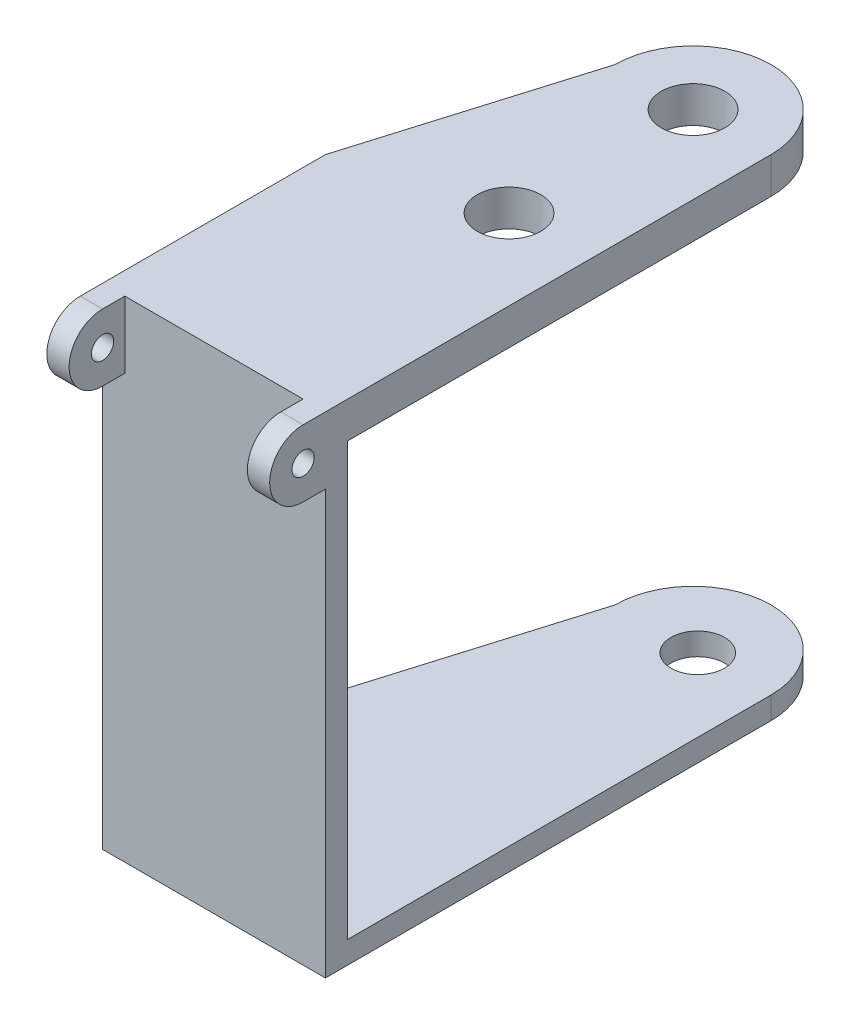
ISO-10303-21;
HEADER;
FILE_DESCRIPTION(('STEP AP214'),'2;1');
FILE_NAME('part.step','',(''),(''),'','','');
FILE_SCHEMA(('AUTOMOTIVE_DESIGN { 1 0 10303 214 1 1 1 1 }'));
ENDSEC;
DATA;
#1=APPLICATION_CONTEXT('core data for automotive mechanical design processes');
#2=APPLICATION_PROTOCOL_DEFINITION('international standard','automotive_design',2000,#1);
#3=PRODUCT_CONTEXT('',#1,'mechanical');
#4=PRODUCT('Part','Part','',(#3));
#5=PRODUCT_RELATED_PRODUCT_CATEGORY('part','',(#4));
#6=PRODUCT_DEFINITION_FORMATION('','',#4);
#7=PRODUCT_DEFINITION_CONTEXT('part definition',#1,'design');
#8=PRODUCT_DEFINITION('design','',#6,#7);
#9=PRODUCT_DEFINITION_SHAPE('','',#8);
#10=(LENGTH_UNIT() NAMED_UNIT(*) SI_UNIT(.MILLI.,.METRE.));
#11=(NAMED_UNIT(*) PLANE_ANGLE_UNIT() SI_UNIT($,.RADIAN.));
#12=(NAMED_UNIT(*) SI_UNIT($,.STERADIAN.) SOLID_ANGLE_UNIT());
#13=UNCERTAINTY_MEASURE_WITH_UNIT(LENGTH_MEASURE(1.E-05),#10,'distance_accuracy_value','');
#14=(GEOMETRIC_REPRESENTATION_CONTEXT(3) GLOBAL_UNCERTAINTY_ASSIGNED_CONTEXT((#13)) GLOBAL_UNIT_ASSIGNED_CONTEXT((#10,
#11,#12)) REPRESENTATION_CONTEXT('',''));
#15=CARTESIAN_POINT('',(0.,0.,0.));
#16=DIRECTION('',(0.,0.,1.));
#17=DIRECTION('',(1.,0.,0.));
#18=AXIS2_PLACEMENT_3D('',#15,#16,#17);
#19=CARTESIAN_POINT('',(-6.32944380535266,-18.6300290870616,8.81175741175494));
#20=DIRECTION('',(0.,0.,1.));
#21=DIRECTION('',(1.,0.,0.));
#22=AXIS2_PLACEMENT_3D('',#19,#20,#21);
#23=PLANE('',#22);
#24=DIRECTION('',(-1.,0.,0.));
#25=VECTOR('',#24,1.);
#26=CARTESIAN_POINT('',(-6.32944380535266,6.37269818566567,8.81175741175494));
#27=LINE('',#26,#25);
#28=CARTESIAN_POINT('',(5.94328346737462,6.37269818566567,8.81175741175494));
#29=VERTEX_POINT('',#28);
#30=CARTESIAN_POINT('',(-6.32944380535266,6.37269818566567,8.81175741175494));
#31=VERTEX_POINT('',#30);
#32=EDGE_CURVE('E187',#29,#31,#27,.T.);
#33=ORIENTED_EDGE('',*,*,#32,.F.);
#34=DIRECTION('',(0.,1.,0.));
#35=VECTOR('',#34,1.);
#36=CARTESIAN_POINT('',(5.94328346737462,-18.6300290870616,8.81175741175494));
#37=LINE('',#36,#35);
#38=CARTESIAN_POINT('',(5.94328346737462,-17.4027563597889,8.81175741175494));
#39=VERTEX_POINT('',#38);
#40=EDGE_CURVE('E173',#39,#29,#37,.T.);
#41=ORIENTED_EDGE('',*,*,#40,.F.);
#42=DIRECTION('',(1.,0.,0.));
#43=VECTOR('',#42,1.);
#44=CARTESIAN_POINT('',(-6.32944380535266,-17.4027563597889,8.81175741175494));
#45=LINE('',#44,#43);
#46=CARTESIAN_POINT('',(-6.32944380535266,-17.4027563597889,8.81175741175494));
#47=VERTEX_POINT('',#46);
#48=EDGE_CURVE('E335',#47,#39,#45,.T.);
#49=ORIENTED_EDGE('',*,*,#48,.F.);
#50=DIRECTION('',(0.,1.,0.));
#51=VECTOR('',#50,1.);
#52=CARTESIAN_POINT('',(-6.32944380535266,-18.6300290870616,8.81175741175494));
#53=LINE('',#52,#51);
#54=EDGE_CURVE('E356',#47,#31,#53,.T.);
#55=ORIENTED_EDGE('',*,*,#54,.T.);
#56=EDGE_LOOP('',(#33,#41,#49,#55));
#57=FACE_BOUND('',#56,.T.);
#58=ADVANCED_FACE('F43',(#57),#23,.F.);
#59=CARTESIAN_POINT('',(5.94328346737462,8.3699709129384,10.0390301390277));
#60=DIRECTION('',(0.,0.,-1.));
#61=DIRECTION('',(-1.,0.,0.));
#62=AXIS2_PLACEMENT_3D('',#59,#60,#61);
#63=PLANE('',#62);
#64=DIRECTION('',(0.,-1.,0.));
#65=VECTOR('',#64,1.);
#66=CARTESIAN_POINT('',(4.71601074010189,8.3699709129384,10.0390301390277));
#67=LINE('',#66,#65);
#68=CARTESIAN_POINT('',(4.71601074010189,8.3699709129384,10.0390301390277));
#69=VERTEX_POINT('',#68);
#70=CARTESIAN_POINT('',(4.71601074010189,4.68815273112021,10.0390301390277));
#71=VERTEX_POINT('',#70);
#72=EDGE_CURVE('E59',#69,#71,#67,.T.);
#73=ORIENTED_EDGE('',*,*,#72,.F.);
#74=DIRECTION('',(-1.,0.,0.));
#75=VECTOR('',#74,1.);
#76=CARTESIAN_POINT('',(5.94328346737462,8.3699709129384,10.0390301390277));
#77=LINE('',#76,#75);
#78=CARTESIAN_POINT('',(-5.10217107807993,8.3699709129384,10.0390301390277));
#79=VERTEX_POINT('',#78);
#80=EDGE_CURVE('E220',#69,#79,#77,.T.);
#81=ORIENTED_EDGE('',*,*,#80,.T.);
#82=DIRECTION('',(0.,-1.,0.));
#83=VECTOR('',#82,1.);
#84=CARTESIAN_POINT('',(-5.10217107807993,8.3699709129384,10.0390301390277));
#85=LINE('',#84,#83);
#86=CARTESIAN_POINT('',(-5.10217107807993,4.68815273112021,10.0390301390277));
#87=VERTEX_POINT('',#86);
#88=EDGE_CURVE('E247',#79,#87,#85,.T.);
#89=ORIENTED_EDGE('',*,*,#88,.T.);
#90=DIRECTION('',(-1.,0.,0.));
#91=VECTOR('',#90,1.);
#92=CARTESIAN_POINT('',(-5.10217107807993,4.68815273112021,10.0390301390277));
#93=LINE('',#92,#91);
#94=CARTESIAN_POINT('',(-6.32944380535266,4.68815273112021,10.0390301390277));
#95=VERTEX_POINT('',#94);
#96=EDGE_CURVE('E254',#87,#95,#93,.T.);
#97=ORIENTED_EDGE('',*,*,#96,.T.);
#98=DIRECTION('',(0.,-1.,0.));
#99=VECTOR('',#98,1.);
#100=CARTESIAN_POINT('',(-6.32944380535266,8.3699709129384,10.0390301390277));
#101=LINE('',#100,#99);
#102=CARTESIAN_POINT('',(-6.32944380535266,-18.6300290870616,10.0390301390277));
#103=VERTEX_POINT('',#102);
#104=EDGE_CURVE('E52',#95,#103,#101,.T.);
#105=ORIENTED_EDGE('',*,*,#104,.T.);
#106=DIRECTION('',(-1.,0.,0.));
#107=VECTOR('',#106,1.);
#108=CARTESIAN_POINT('',(-6.32944380535266,-18.6300290870616,10.0390301390277));
#109=LINE('',#108,#107);
#110=CARTESIAN_POINT('',(5.94328346737462,-18.6300290870616,10.0390301390277));
#111=VERTEX_POINT('',#110);
#112=EDGE_CURVE('E349',#111,#103,#109,.T.);
#113=ORIENTED_EDGE('',*,*,#112,.F.);
#114=DIRECTION('',(0.,-1.,0.));
#115=VECTOR('',#114,1.);
#116=CARTESIAN_POINT('',(5.94328346737462,8.3699709129384,10.0390301390277));
#117=LINE('',#116,#115);
#118=CARTESIAN_POINT('',(5.94328346737462,4.68815273112021,10.0390301390277));
#119=VERTEX_POINT('',#118);
#120=EDGE_CURVE('E367',#119,#111,#117,.T.);
#121=ORIENTED_EDGE('',*,*,#120,.F.);
#122=DIRECTION('',(1.,0.,0.));
#123=VECTOR('',#122,1.);
#124=CARTESIAN_POINT('',(4.71601074010189,4.68815273112021,10.0390301390277));
#125=LINE('',#124,#123);
#126=EDGE_CURVE('E290',#71,#119,#125,.T.);
#127=ORIENTED_EDGE('',*,*,#126,.F.);
#128=EDGE_LOOP('',(#73,#81,#89,#97,#105,#113,#121,#127));
#129=FACE_BOUND('',#128,.T.);
#130=ADVANCED_FACE('F380',(#129),#63,.F.);
#131=CARTESIAN_POINT('',(-6.32944380535266,8.3699709129384,10.0390301390277));
#132=DIRECTION('',(1.,0.,0.));
#133=DIRECTION('',(0.,0.,-1.));
#134=AXIS2_PLACEMENT_3D('',#131,#132,#133);
#135=PLANE('',#134);
#136=CARTESIAN_POINT('',(-6.32944380535266,6.52906182202931,11.2663028663004));
#137=DIRECTION('',(-1.,0.,0.));
#138=DIRECTION('',(0.,0.,1.));
#139=AXIS2_PLACEMENT_3D('',#136,#137,#138);
#140=CIRCLE('',#139,0.613636363636365);
#141=CARTESIAN_POINT('',(-6.32944380535266,6.52906182202931,11.8799392299368));
#142=VERTEX_POINT('',#141);
#143=EDGE_CURVE('E234',#142,#142,#140,.T.);
#144=ORIENTED_EDGE('',*,*,#143,.F.);
#145=EDGE_LOOP('',(#144));
#146=FACE_BOUND('',#145,.T.);
#147=CARTESIAN_POINT('',(-6.32944380535266,6.52906182202931,11.2663028663004));
#148=DIRECTION('',(-1.,0.,0.));
#149=DIRECTION('',(0.,0.,1.));
#150=AXIS2_PLACEMENT_3D('',#147,#148,#149);
#151=CIRCLE('',#150,1.84090909090909);
#152=CARTESIAN_POINT('',(-6.32944380535266,4.68815273112021,11.2663028663004));
#153=VERTEX_POINT('',#152);
#154=CARTESIAN_POINT('',(-6.32944380535266,8.3699709129384,11.2663028663004));
#155=VERTEX_POINT('',#154);
#156=EDGE_CURVE('E239',#153,#155,#151,.T.);
#157=ORIENTED_EDGE('',*,*,#156,.T.);
#158=DIRECTION('',(0.,0.,-1.));
#159=VECTOR('',#158,1.);
#160=CARTESIAN_POINT('',(-6.32944380535266,8.3699709129384,11.2663028663004));
#161=LINE('',#160,#159);
#162=CARTESIAN_POINT('',(-6.32944380535266,8.3699709129384,-2.2336971336996));
#163=VERTEX_POINT('',#162);
#164=EDGE_CURVE('E168',#155,#163,#161,.T.);
#165=ORIENTED_EDGE('',*,*,#164,.T.);
#166=DIRECTION('',(0.,1.,0.));
#167=VECTOR('',#166,1.);
#168=CARTESIAN_POINT('',(-6.32944380535266,4.6881527311202,-2.2336971336996));
#169=LINE('',#168,#167);
#170=CARTESIAN_POINT('',(-6.32944380535266,6.37269818566567,-2.2336971336996));
#171=VERTEX_POINT('',#170);
#172=EDGE_CURVE('E161',#171,#163,#169,.T.);
#173=ORIENTED_EDGE('',*,*,#172,.F.);
#174=DIRECTION('',(0.,0.,-1.));
#175=VECTOR('',#174,1.);
#176=CARTESIAN_POINT('',(-6.32944380535266,6.37269818566567,-2.2336971336996));
#177=LINE('',#176,#175);
#178=EDGE_CURVE('E166',#31,#171,#177,.T.);
#179=ORIENTED_EDGE('',*,*,#178,.F.);
#180=ORIENTED_EDGE('',*,*,#54,.F.);
#181=DIRECTION('',(0.,0.,1.));
#182=VECTOR('',#181,1.);
#183=CARTESIAN_POINT('',(-6.32944380535266,-17.4027563597889,-15.7336971336996));
#184=LINE('',#183,#182);
#185=CARTESIAN_POINT('',(-6.32944380535266,-17.4027563597889,-2.2336971336996));
#186=VERTEX_POINT('',#185);
#187=EDGE_CURVE('E339',#186,#47,#184,.T.);
#188=ORIENTED_EDGE('',*,*,#187,.F.);
#189=DIRECTION('',(0.,1.,0.));
#190=VECTOR('',#189,1.);
#191=CARTESIAN_POINT('',(-6.32944380535266,-41.9482109052434,-2.2336971336996));
#192=LINE('',#191,#190);
#193=CARTESIAN_POINT('',(-6.32944380535266,-18.6300290870616,-2.2336971336996));
#194=VERTEX_POINT('',#193);
#195=EDGE_CURVE('E326',#194,#186,#192,.T.);
#196=ORIENTED_EDGE('',*,*,#195,.F.);
#197=DIRECTION('',(0.,0.,-1.));
#198=VECTOR('',#197,1.);
#199=CARTESIAN_POINT('',(-6.32944380535266,-18.6300290870616,8.81175741175494));
#200=LINE('',#199,#198);
#201=EDGE_CURVE('E352',#103,#194,#200,.T.);
#202=ORIENTED_EDGE('',*,*,#201,.F.);
#203=ORIENTED_EDGE('',*,*,#104,.F.);
#204=DIRECTION('',(0.,0.,-1.));
#205=VECTOR('',#204,1.);
#206=CARTESIAN_POINT('',(-6.32944380535266,4.68815273112021,11.2663028663004));
#207=LINE('',#206,#205);
#208=EDGE_CURVE('E266',#153,#95,#207,.T.);
#209=ORIENTED_EDGE('',*,*,#208,.F.);
#210=EDGE_LOOP('',(#157,#165,#173,#179,#180,#188,#196,#202,#203,#209));
#211=FACE_BOUND('',#210,.T.);
#212=ADVANCED_FACE('F45',(#146,#211),#135,.F.);
#213=CARTESIAN_POINT('',(5.94328346737462,8.3699709129384,10.0390301390277));
#214=DIRECTION('',(-1.,0.,0.));
#215=DIRECTION('',(0.,0.,1.));
#216=AXIS2_PLACEMENT_3D('',#213,#214,#215);
#217=PLANE('',#216);
#218=CARTESIAN_POINT('',(5.94328346737462,6.52906182202931,11.2663028663004));
#219=DIRECTION('',(1.,0.,0.));
#220=DIRECTION('',(0.,0.,-1.));
#221=AXIS2_PLACEMENT_3D('',#218,#219,#220);
#222=CIRCLE('',#221,0.613636363636365);
#223=CARTESIAN_POINT('',(5.94328346737462,6.52906182202931,10.652666502664));
#224=VERTEX_POINT('',#223);
#225=EDGE_CURVE('E269',#224,#224,#222,.T.);
#226=ORIENTED_EDGE('',*,*,#225,.F.);
#227=EDGE_LOOP('',(#226));
#228=FACE_BOUND('',#227,.T.);
#229=DIRECTION('',(0.,-1.,0.));
#230=VECTOR('',#229,1.);
#231=CARTESIAN_POINT('',(5.94328346737462,8.3699709129384,-14.5064244064269));
#232=LINE('',#231,#230);
#233=CARTESIAN_POINT('',(5.94328346737462,8.3699709129384,-14.5064244064269));
#234=VERTEX_POINT('',#233);
#235=CARTESIAN_POINT('',(5.94328346737462,6.37269818566567,-14.5064244064269));
#236=VERTEX_POINT('',#235);
#237=EDGE_CURVE('E363',#234,#236,#232,.T.);
#238=ORIENTED_EDGE('',*,*,#237,.F.);
#239=DIRECTION('',(0.,0.,-1.));
#240=VECTOR('',#239,1.);
#241=CARTESIAN_POINT('',(5.94328346737462,8.3699709129384,11.2663028663004));
#242=LINE('',#241,#240);
#243=CARTESIAN_POINT('',(5.94328346737462,8.3699709129384,11.2663028663004));
#244=VERTEX_POINT('',#243);
#245=EDGE_CURVE('E204',#244,#234,#242,.T.);
#246=ORIENTED_EDGE('',*,*,#245,.F.);
#247=CARTESIAN_POINT('',(5.94328346737462,6.52906182202931,11.2663028663004));
#248=DIRECTION('',(-1.,0.,0.));
#249=DIRECTION('',(0.,0.,1.));
#250=AXIS2_PLACEMENT_3D('',#247,#248,#249);
#251=CIRCLE('',#250,1.84090909090909);
#252=CARTESIAN_POINT('',(5.94328346737462,4.68815273112021,11.2663028663004));
#253=VERTEX_POINT('',#252);
#254=EDGE_CURVE('E274',#253,#244,#251,.T.);
#255=ORIENTED_EDGE('',*,*,#254,.F.);
#256=DIRECTION('',(0.,0.,-1.));
#257=VECTOR('',#256,1.);
#258=CARTESIAN_POINT('',(5.94328346737462,4.68815273112021,11.2663028663004));
#259=LINE('',#258,#257);
#260=EDGE_CURVE('E294',#253,#119,#259,.T.);
#261=ORIENTED_EDGE('',*,*,#260,.T.);
#262=ORIENTED_EDGE('',*,*,#120,.T.);
#263=DIRECTION('',(0.,0.,1.));
#264=VECTOR('',#263,1.);
#265=CARTESIAN_POINT('',(5.94328346737462,-18.6300290870616,8.81175741175494));
#266=LINE('',#265,#264);
#267=CARTESIAN_POINT('',(5.94328346737462,-18.6300290870616,-14.5064244064269));
#268=VERTEX_POINT('',#267);
#269=EDGE_CURVE('E345',#268,#111,#266,.T.);
#270=ORIENTED_EDGE('',*,*,#269,.F.);
#271=DIRECTION('',(0.,1.,0.));
#272=VECTOR('',#271,1.);
#273=CARTESIAN_POINT('',(5.94328346737462,-41.9482109052434,-14.5064244064269));
#274=LINE('',#273,#272);
#275=CARTESIAN_POINT('',(5.94328346737462,-17.4027563597889,-14.5064244064269));
#276=VERTEX_POINT('',#275);
#277=EDGE_CURVE('E332',#268,#276,#274,.T.);
#278=ORIENTED_EDGE('',*,*,#277,.T.);
#279=DIRECTION('',(0.,0.,1.));
#280=VECTOR('',#279,1.);
#281=CARTESIAN_POINT('',(5.94328346737462,-17.4027563597889,-15.7336971336996));
#282=LINE('',#281,#280);
#283=EDGE_CURVE('E342',#276,#39,#282,.T.);
#284=ORIENTED_EDGE('',*,*,#283,.T.);
#285=ORIENTED_EDGE('',*,*,#40,.T.);
#286=DIRECTION('',(0.,0.,1.));
#287=VECTOR('',#286,1.);
#288=CARTESIAN_POINT('',(5.94328346737462,6.37269818566567,8.81175741175494));
#289=LINE('',#288,#287);
#290=EDGE_CURVE('E199',#236,#29,#289,.T.);
#291=ORIENTED_EDGE('',*,*,#290,.F.);
#292=EDGE_LOOP('',(#238,#246,#255,#261,#262,#270,#278,#284,#285,#291));
#293=FACE_BOUND('',#292,.T.);
#294=ADVANCED_FACE('F372',(#228,#293),#217,.F.);
#295=CARTESIAN_POINT('',(-6.32944380535266,4.6881527311202,-2.2336971336996));
#296=DIRECTION('',(0.957826285221151,0.,0.287347885566345));
#297=DIRECTION('',(0.287347885566345,0.,-0.957826285221152));
#298=AXIS2_PLACEMENT_3D('',#295,#296,#297);
#299=PLANE('',#298);
#300=ORIENTED_EDGE('',*,*,#172,.T.);
#301=DIRECTION('',(0.287347885566345,0.,-0.957826285221152));
#302=VECTOR('',#301,1.);
#303=CARTESIAN_POINT('',(-6.32944380535266,8.3699709129384,-2.2336971336996));
#304=LINE('',#303,#302);
#305=CARTESIAN_POINT('',(-2.64762562353448,8.3699709129384,-14.5064244064269));
#306=VERTEX_POINT('',#305);
#307=EDGE_CURVE('E231',#163,#306,#304,.T.);
#308=ORIENTED_EDGE('',*,*,#307,.T.);
#309=DIRECTION('',(0.,1.,0.));
#310=VECTOR('',#309,1.);
#311=CARTESIAN_POINT('',(-2.64762562353448,4.6881527311202,-14.5064244064269));
#312=LINE('',#311,#310);
#313=CARTESIAN_POINT('',(-2.64762562353448,6.37269818566567,-14.5064244064269));
#314=VERTEX_POINT('',#313);
#315=EDGE_CURVE('E172',#314,#306,#312,.T.);
#316=ORIENTED_EDGE('',*,*,#315,.F.);
#317=DIRECTION('',(0.287347885566345,0.,-0.957826285221151));
#318=VECTOR('',#317,1.);
#319=CARTESIAN_POINT('',(-2.64762562353447,6.37269818566567,-14.5064244064269));
#320=LINE('',#319,#318);
#321=EDGE_CURVE('E176',#171,#314,#320,.T.);
#322=ORIENTED_EDGE('',*,*,#321,.F.);
#323=EDGE_LOOP('',(#300,#308,#316,#322));
#324=FACE_BOUND('',#323,.T.);
#325=ADVANCED_FACE('F177',(#324),#299,.F.);
#326=CARTESIAN_POINT('',(1.64782892192007,8.3699709129384,-14.5064244064269));
#327=DIRECTION('',(0.,-1.,0.));
#328=DIRECTION('',(0.,0.,-1.));
#329=AXIS2_PLACEMENT_3D('',#326,#327,#328);
#330=CYLINDRICAL_SURFACE('',#329,4.29545454545455);
#331=ORIENTED_EDGE('',*,*,#315,.T.);
#332=CARTESIAN_POINT('',(1.64782892192007,8.3699709129384,-14.5064244064269));
#333=DIRECTION('',(0.,-1.,0.));
#334=DIRECTION('',(0.,0.,-1.));
#335=AXIS2_PLACEMENT_3D('',#332,#333,#334);
#336=CIRCLE('',#335,4.29545454545455);
#337=EDGE_CURVE('E227',#306,#234,#336,.T.);
#338=ORIENTED_EDGE('',*,*,#337,.T.);
#339=ORIENTED_EDGE('',*,*,#237,.T.);
#340=CARTESIAN_POINT('',(1.64782892192007,6.37269818566567,-14.5064244064269));
#341=DIRECTION('',(0.,-1.,0.));
#342=DIRECTION('',(0.,0.,-1.));
#343=AXIS2_PLACEMENT_3D('',#340,#341,#342);
#344=CIRCLE('',#343,4.29545454545455);
#345=EDGE_CURVE('E183',#314,#236,#344,.T.);
#346=ORIENTED_EDGE('',*,*,#345,.F.);
#347=EDGE_LOOP('',(#331,#338,#339,#346));
#348=FACE_BOUND('',#347,.T.);
#349=ADVANCED_FACE('F397',(#348),#330,.T.);
#350=CARTESIAN_POINT('',(-0.19308016898902,-18.6300290870616,-2.2336971336996));
#351=DIRECTION('',(0.,-1.,0.));
#352=DIRECTION('',(0.,0.,-1.));
#353=AXIS2_PLACEMENT_3D('',#350,#351,#352);
#354=PLANE('',#353);
#355=CARTESIAN_POINT('',(1.91382489305972,-18.6300290870616,-14.4985439968304));
#356=DIRECTION('',(0.,1.,0.));
#357=DIRECTION('',(0.,0.,1.));
#358=AXIS2_PLACEMENT_3D('',#355,#356,#357);
#359=CIRCLE('',#358,1.47272727272727);
#360=CARTESIAN_POINT('',(1.91382489305972,-18.6300290870616,-13.0258167241031));
#361=VERTEX_POINT('',#360);
#362=EDGE_CURVE('E308',#361,#361,#359,.T.);
#363=ORIENTED_EDGE('',*,*,#362,.T.);
#364=EDGE_LOOP('',(#363));
#365=FACE_BOUND('',#364,.T.);
#366=DIRECTION('',(-0.287347885566345,0.,0.957826285221152));
#367=VECTOR('',#366,1.);
#368=CARTESIAN_POINT('',(-5.82277157849694,-18.6300290870616,-3.92260455655198));
#369=LINE('',#368,#367);
#370=CARTESIAN_POINT('',(-2.64762562353448,-18.6300290870616,-14.5064244064269));
#371=VERTEX_POINT('',#370);
#372=EDGE_CURVE('E329',#371,#194,#369,.T.);
#373=ORIENTED_EDGE('',*,*,#372,.F.);
#374=CARTESIAN_POINT('',(1.64782892192007,-18.6300290870616,-14.5064244064269));
#375=DIRECTION('',(0.,1.,0.));
#376=DIRECTION('',(0.,0.,1.));
#377=AXIS2_PLACEMENT_3D('',#374,#375,#376);
#378=CIRCLE('',#377,4.29545454545455);
#379=EDGE_CURVE('E316',#268,#371,#378,.T.);
#380=ORIENTED_EDGE('',*,*,#379,.F.);
#381=ORIENTED_EDGE('',*,*,#269,.T.);
#382=ORIENTED_EDGE('',*,*,#112,.T.);
#383=ORIENTED_EDGE('',*,*,#201,.T.);
#384=EDGE_LOOP('',(#373,#380,#381,#382,#383));
#385=FACE_BOUND('',#384,.T.);
#386=ADVANCED_FACE('F378',(#365,#385),#354,.T.);
#387=CARTESIAN_POINT('',(-6.32944380535266,-17.4027563597889,-15.7336971336996));
#388=DIRECTION('',(0.,-1.,0.));
#389=DIRECTION('',(0.,0.,-1.));
#390=AXIS2_PLACEMENT_3D('',#387,#388,#389);
#391=PLANE('',#390);
#392=CARTESIAN_POINT('',(1.91382489305972,-17.4027563597889,-14.4985439968304));
#393=DIRECTION('',(0.,1.,0.));
#394=DIRECTION('',(0.,0.,1.));
#395=AXIS2_PLACEMENT_3D('',#392,#393,#394);
#396=CIRCLE('',#395,1.47272727272727);
#397=CARTESIAN_POINT('',(1.91382489305972,-17.4027563597889,-13.0258167241031));
#398=VERTEX_POINT('',#397);
#399=EDGE_CURVE('E307',#398,#398,#396,.T.);
#400=ORIENTED_EDGE('',*,*,#399,.F.);
#401=EDGE_LOOP('',(#400));
#402=FACE_BOUND('',#401,.T.);
#403=ORIENTED_EDGE('',*,*,#283,.F.);
#404=CARTESIAN_POINT('',(1.64782892192007,-17.4027563597889,-14.5064244064269));
#405=DIRECTION('',(0.,1.,0.));
#406=DIRECTION('',(0.,0.,1.));
#407=AXIS2_PLACEMENT_3D('',#404,#405,#406);
#408=CIRCLE('',#407,4.29545454545455);
#409=CARTESIAN_POINT('',(-2.64762562353448,-17.4027563597889,-14.5064244064268));
#410=VERTEX_POINT('',#409);
#411=EDGE_CURVE('E312',#276,#410,#408,.T.);
#412=ORIENTED_EDGE('',*,*,#411,.T.);
#413=DIRECTION('',(0.287347885566345,0.,-0.957826285221151));
#414=VECTOR('',#413,1.);
#415=CARTESIAN_POINT('',(-2.64762562353448,-17.4027563597889,-14.5064244064269));
#416=LINE('',#415,#414);
#417=EDGE_CURVE('E320',#186,#410,#416,.T.);
#418=ORIENTED_EDGE('',*,*,#417,.F.);
#419=ORIENTED_EDGE('',*,*,#187,.T.);
#420=ORIENTED_EDGE('',*,*,#48,.T.);
#421=EDGE_LOOP('',(#403,#412,#418,#419,#420));
#422=FACE_BOUND('',#421,.T.);
#423=ADVANCED_FACE('F403',(#402,#422),#391,.F.);
#424=CARTESIAN_POINT('',(-2.64762562353448,-41.9482109052434,-14.5064244064269));
#425=DIRECTION('',(0.957826285221152,0.,0.287347885566345));
#426=DIRECTION('',(0.287347885566345,0.,-0.957826285221152));
#427=AXIS2_PLACEMENT_3D('',#424,#425,#426);
#428=PLANE('',#427);
#429=ORIENTED_EDGE('',*,*,#372,.T.);
#430=ORIENTED_EDGE('',*,*,#195,.T.);
#431=ORIENTED_EDGE('',*,*,#417,.T.);
#432=DIRECTION('',(0.,1.,0.));
#433=VECTOR('',#432,1.);
#434=CARTESIAN_POINT('',(-2.64762562353448,-41.9482109052434,-14.5064244064269));
#435=LINE('',#434,#433);
#436=EDGE_CURVE('E11',#371,#410,#435,.T.);
#437=ORIENTED_EDGE('',*,*,#436,.F.);
#438=EDGE_LOOP('',(#429,#430,#431,#437));
#439=FACE_BOUND('',#438,.T.);
#440=ADVANCED_FACE('F407',(#439),#428,.F.);
#441=CARTESIAN_POINT('',(1.64782892192007,-18.6300290870616,-14.5064244064269));
#442=DIRECTION('',(0.,1.,0.));
#443=DIRECTION('',(0.,0.,1.));
#444=AXIS2_PLACEMENT_3D('',#441,#442,#443);
#445=CYLINDRICAL_SURFACE('',#444,4.29545454545455);
#446=ORIENTED_EDGE('',*,*,#411,.F.);
#447=ORIENTED_EDGE('',*,*,#277,.F.);
#448=ORIENTED_EDGE('',*,*,#379,.T.);
#449=ORIENTED_EDGE('',*,*,#436,.T.);
#450=EDGE_LOOP('',(#446,#447,#448,#449));
#451=FACE_BOUND('',#450,.T.);
#452=ADVANCED_FACE('F411',(#451),#445,.T.);
#453=CARTESIAN_POINT('',(1.91382489305972,-18.6300290870616,-14.4985439968304));
#454=DIRECTION('',(0.,1.,0.));
#455=DIRECTION('',(0.,0.,1.));
#456=AXIS2_PLACEMENT_3D('',#453,#454,#455);
#457=CYLINDRICAL_SURFACE('',#456,1.47272727272727);
#458=ORIENTED_EDGE('',*,*,#362,.F.);
#459=EDGE_LOOP('',(#458));
#460=FACE_BOUND('',#459,.T.);
#461=ORIENTED_EDGE('',*,*,#399,.T.);
#462=EDGE_LOOP('',(#461));
#463=FACE_BOUND('',#462,.T.);
#464=ADVANCED_FACE('F415',(#460,#463),#457,.F.);
#465=CARTESIAN_POINT('',(4.71601074010189,8.3699709129384,11.2663028663004));
#466=DIRECTION('',(1.,0.,0.));
#467=DIRECTION('',(0.,0.,-1.));
#468=AXIS2_PLACEMENT_3D('',#465,#466,#467);
#469=PLANE('',#468);
#470=CARTESIAN_POINT('',(4.71601074010189,6.52906182202931,11.2663028663004));
#471=DIRECTION('',(1.,0.,0.));
#472=DIRECTION('',(0.,0.,-1.));
#473=AXIS2_PLACEMENT_3D('',#470,#471,#472);
#474=CIRCLE('',#473,0.613636363636365);
#475=CARTESIAN_POINT('',(4.71601074010189,6.52906182202931,10.652666502664));
#476=VERTEX_POINT('',#475);
#477=EDGE_CURVE('E270',#476,#476,#474,.T.);
#478=ORIENTED_EDGE('',*,*,#477,.T.);
#479=EDGE_LOOP('',(#478));
#480=FACE_BOUND('',#479,.T.);
#481=CARTESIAN_POINT('',(4.71601074010189,6.52906182202931,11.2663028663004));
#482=DIRECTION('',(-1.,0.,0.));
#483=DIRECTION('',(0.,0.,1.));
#484=AXIS2_PLACEMENT_3D('',#481,#482,#483);
#485=CIRCLE('',#484,1.84090909090909);
#486=CARTESIAN_POINT('',(4.71601074010189,4.68815273112021,11.2663028663004));
#487=VERTEX_POINT('',#486);
#488=CARTESIAN_POINT('',(4.71601074010189,8.3699709129384,11.2663028663004));
#489=VERTEX_POINT('',#488);
#490=EDGE_CURVE('E278',#487,#489,#485,.T.);
#491=ORIENTED_EDGE('',*,*,#490,.T.);
#492=DIRECTION('',(0.,0.,-1.));
#493=VECTOR('',#492,1.);
#494=CARTESIAN_POINT('',(4.71601074010189,8.3699709129384,11.2663028663004));
#495=LINE('',#494,#493);
#496=EDGE_CURVE('E224',#489,#69,#495,.T.);
#497=ORIENTED_EDGE('',*,*,#496,.T.);
#498=ORIENTED_EDGE('',*,*,#72,.T.);
#499=DIRECTION('',(0.,0.,-1.));
#500=VECTOR('',#499,1.);
#501=CARTESIAN_POINT('',(4.71601074010189,4.68815273112021,11.2663028663004));
#502=LINE('',#501,#500);
#503=EDGE_CURVE('E303',#487,#71,#502,.T.);
#504=ORIENTED_EDGE('',*,*,#503,.F.);
#505=EDGE_LOOP('',(#491,#497,#498,#504));
#506=FACE_BOUND('',#505,.T.);
#507=ADVANCED_FACE('F419',(#480,#506),#469,.F.);
#508=CARTESIAN_POINT('',(4.71601074010189,4.68815273112021,11.2663028663004));
#509=DIRECTION('',(0.,1.,0.));
#510=DIRECTION('',(0.,0.,1.));
#511=AXIS2_PLACEMENT_3D('',#508,#509,#510);
#512=PLANE('',#511);
#513=ORIENTED_EDGE('',*,*,#126,.T.);
#514=ORIENTED_EDGE('',*,*,#260,.F.);
#515=DIRECTION('',(1.,0.,0.));
#516=VECTOR('',#515,1.);
#517=CARTESIAN_POINT('',(4.71601074010189,4.68815273112021,11.2663028663004));
#518=LINE('',#517,#516);
#519=EDGE_CURVE('E285',#487,#253,#518,.T.);
#520=ORIENTED_EDGE('',*,*,#519,.F.);
#521=ORIENTED_EDGE('',*,*,#503,.T.);
#522=EDGE_LOOP('',(#513,#514,#520,#521));
#523=FACE_BOUND('',#522,.T.);
#524=ADVANCED_FACE('F422',(#523),#512,.F.);
#525=CARTESIAN_POINT('',(4.71601074010189,6.52906182202931,11.2663028663004));
#526=DIRECTION('',(1.,0.,0.));
#527=DIRECTION('',(0.,0.,-1.));
#528=AXIS2_PLACEMENT_3D('',#525,#526,#527);
#529=CYLINDRICAL_SURFACE('',#528,1.84090909090909);
#530=ORIENTED_EDGE('',*,*,#254,.T.);
#531=DIRECTION('',(-1.,0.,0.));
#532=VECTOR('',#531,1.);
#533=CARTESIAN_POINT('',(4.71601074010189,8.3699709129384,11.2663028663004));
#534=LINE('',#533,#532);
#535=EDGE_CURVE('E289',#244,#489,#534,.T.);
#536=ORIENTED_EDGE('',*,*,#535,.T.);
#537=ORIENTED_EDGE('',*,*,#490,.F.);
#538=ORIENTED_EDGE('',*,*,#519,.T.);
#539=EDGE_LOOP('',(#530,#536,#537,#538));
#540=FACE_BOUND('',#539,.T.);
#541=ADVANCED_FACE('F426',(#540),#529,.T.);
#542=CARTESIAN_POINT('',(4.71601074010189,6.52906182202931,11.2663028663004));
#543=DIRECTION('',(1.,0.,0.));
#544=DIRECTION('',(0.,0.,-1.));
#545=AXIS2_PLACEMENT_3D('',#542,#543,#544);
#546=CYLINDRICAL_SURFACE('',#545,0.613636363636365);
#547=ORIENTED_EDGE('',*,*,#477,.F.);
#548=EDGE_LOOP('',(#547));
#549=FACE_BOUND('',#548,.T.);
#550=ORIENTED_EDGE('',*,*,#225,.T.);
#551=EDGE_LOOP('',(#550));
#552=FACE_BOUND('',#551,.T.);
#553=ADVANCED_FACE('F430',(#549,#552),#546,.F.);
#554=CARTESIAN_POINT('',(-5.10217107807993,8.3699709129384,11.2663028663004));
#555=DIRECTION('',(1.,0.,0.));
#556=DIRECTION('',(0.,0.,-1.));
#557=AXIS2_PLACEMENT_3D('',#554,#555,#556);
#558=PLANE('',#557);
#559=DIRECTION('',(0.,0.,-1.));
#560=VECTOR('',#559,1.);
#561=CARTESIAN_POINT('',(-5.10217107807993,8.3699709129384,11.2663028663004));
#562=LINE('',#561,#560);
#563=CARTESIAN_POINT('',(-5.10217107807993,8.3699709129384,11.2663028663004));
#564=VERTEX_POINT('',#563);
#565=EDGE_CURVE('E217',#564,#79,#562,.T.);
#566=ORIENTED_EDGE('',*,*,#565,.F.);
#567=CARTESIAN_POINT('',(-5.10217107807993,6.52906182202931,11.2663028663004));
#568=DIRECTION('',(-1.,0.,0.));
#569=DIRECTION('',(0.,0.,1.));
#570=AXIS2_PLACEMENT_3D('',#567,#568,#569);
#571=CIRCLE('',#570,1.84090909090909);
#572=CARTESIAN_POINT('',(-5.10217107807993,4.68815273112021,11.2663028663004));
#573=VERTEX_POINT('',#572);
#574=EDGE_CURVE('E243',#573,#564,#571,.T.);
#575=ORIENTED_EDGE('',*,*,#574,.F.);
#576=DIRECTION('',(0.,0.,-1.));
#577=VECTOR('',#576,1.);
#578=CARTESIAN_POINT('',(-5.10217107807993,4.68815273112021,11.2663028663004));
#579=LINE('',#578,#577);
#580=EDGE_CURVE('E258',#573,#87,#579,.T.);
#581=ORIENTED_EDGE('',*,*,#580,.T.);
#582=ORIENTED_EDGE('',*,*,#88,.F.);
#583=EDGE_LOOP('',(#566,#575,#581,#582));
#584=FACE_BOUND('',#583,.T.);
#585=CARTESIAN_POINT('',(-5.10217107807993,6.52906182202931,11.2663028663004));
#586=DIRECTION('',(-1.,0.,0.));
#587=DIRECTION('',(0.,0.,1.));
#588=AXIS2_PLACEMENT_3D('',#585,#586,#587);
#589=CIRCLE('',#588,0.613636363636365);
#590=CARTESIAN_POINT('',(-5.10217107807993,6.52906182202931,11.8799392299368));
#591=VERTEX_POINT('',#590);
#592=EDGE_CURVE('E235',#591,#591,#589,.T.);
#593=ORIENTED_EDGE('',*,*,#592,.T.);
#594=EDGE_LOOP('',(#593));
#595=FACE_BOUND('',#594,.T.);
#596=ADVANCED_FACE('F434',(#584,#595),#558,.T.);
#597=CARTESIAN_POINT('',(-5.10217107807993,4.68815273112021,11.2663028663004));
#598=DIRECTION('',(0.,-1.,0.));
#599=DIRECTION('',(0.,0.,-1.));
#600=AXIS2_PLACEMENT_3D('',#597,#598,#599);
#601=PLANE('',#600);
#602=ORIENTED_EDGE('',*,*,#96,.F.);
#603=ORIENTED_EDGE('',*,*,#580,.F.);
#604=DIRECTION('',(-1.,0.,0.));
#605=VECTOR('',#604,1.);
#606=CARTESIAN_POINT('',(-5.10217107807993,4.68815273112021,11.2663028663004));
#607=LINE('',#606,#605);
#608=EDGE_CURVE('E253',#573,#153,#607,.T.);
#609=ORIENTED_EDGE('',*,*,#608,.T.);
#610=ORIENTED_EDGE('',*,*,#208,.T.);
#611=EDGE_LOOP('',(#602,#603,#609,#610));
#612=FACE_BOUND('',#611,.T.);
#613=ADVANCED_FACE('F438',(#612),#601,.T.);
#614=CARTESIAN_POINT('',(-5.10217107807993,6.52906182202931,11.2663028663004));
#615=DIRECTION('',(-1.,0.,0.));
#616=DIRECTION('',(0.,0.,1.));
#617=AXIS2_PLACEMENT_3D('',#614,#615,#616);
#618=CYLINDRICAL_SURFACE('',#617,1.84090909090909);
#619=ORIENTED_EDGE('',*,*,#156,.F.);
#620=ORIENTED_EDGE('',*,*,#608,.F.);
#621=ORIENTED_EDGE('',*,*,#574,.T.);
#622=DIRECTION('',(1.,0.,0.));
#623=VECTOR('',#622,1.);
#624=CARTESIAN_POINT('',(-5.10217107807993,8.3699709129384,11.2663028663004));
#625=LINE('',#624,#623);
#626=EDGE_CURVE('E250',#155,#564,#625,.T.);
#627=ORIENTED_EDGE('',*,*,#626,.F.);
#628=EDGE_LOOP('',(#619,#620,#621,#627));
#629=FACE_BOUND('',#628,.T.);
#630=ADVANCED_FACE('F442',(#629),#618,.T.);
#631=CARTESIAN_POINT('',(-5.10217107807993,6.52906182202931,11.2663028663004));
#632=DIRECTION('',(-1.,0.,0.));
#633=DIRECTION('',(0.,0.,1.));
#634=AXIS2_PLACEMENT_3D('',#631,#632,#633);
#635=CYLINDRICAL_SURFACE('',#634,0.613636363636365);
#636=ORIENTED_EDGE('',*,*,#592,.F.);
#637=EDGE_LOOP('',(#636));
#638=FACE_BOUND('',#637,.T.);
#639=ORIENTED_EDGE('',*,*,#143,.T.);
#640=EDGE_LOOP('',(#639));
#641=FACE_BOUND('',#640,.T.);
#642=ADVANCED_FACE('F446',(#638,#641),#635,.F.);
#643=CARTESIAN_POINT('',(1.64782892192007,-1.6300290870616,-14.5064244064269));
#644=DIRECTION('',(0.,1.,0.));
#645=DIRECTION('',(0.,0.,1.));
#646=AXIS2_PLACEMENT_3D('',#643,#644,#645);
#647=CYLINDRICAL_SURFACE('',#646,1.75);
#648=CARTESIAN_POINT('',(1.64782892192007,8.3699709129384,-14.5064244064269));
#649=DIRECTION('',(0.,-1.,0.));
#650=DIRECTION('',(0.,0.,-1.));
#651=AXIS2_PLACEMENT_3D('',#648,#649,#650);
#652=CIRCLE('',#651,1.75);
#653=CARTESIAN_POINT('',(1.64782892192007,8.3699709129384,-16.2564244064269));
#654=VERTEX_POINT('',#653);
#655=EDGE_CURVE('E213',#654,#654,#652,.F.);
#656=ORIENTED_EDGE('',*,*,#655,.T.);
#657=EDGE_LOOP('',(#656));
#658=FACE_BOUND('',#657,.T.);
#659=CARTESIAN_POINT('',(1.64782892192007,6.37269818566567,-14.5064244064269));
#660=DIRECTION('',(0.,1.,0.));
#661=DIRECTION('',(0.,0.,1.));
#662=AXIS2_PLACEMENT_3D('',#659,#660,#661);
#663=CIRCLE('',#662,1.75);
#664=CARTESIAN_POINT('',(1.64782892192007,6.37269818566567,-12.7564244064269));
#665=VERTEX_POINT('',#664);
#666=EDGE_CURVE('E193',#665,#665,#663,.F.);
#667=ORIENTED_EDGE('',*,*,#666,.T.);
#668=EDGE_LOOP('',(#667));
#669=FACE_BOUND('',#668,.T.);
#670=ADVANCED_FACE('F449',(#658,#669),#647,.F.);
#671=CARTESIAN_POINT('',(1.51199548848524,-1.6300290870616,-4.50642440642688));
#672=DIRECTION('',(0.,1.,0.));
#673=DIRECTION('',(0.,0.,1.));
#674=AXIS2_PLACEMENT_3D('',#671,#672,#673);
#675=CYLINDRICAL_SURFACE('',#674,1.75);
#676=CARTESIAN_POINT('',(1.51199548848524,8.3699709129384,-4.50642440642688));
#677=DIRECTION('',(0.,-1.,0.));
#678=DIRECTION('',(0.,0.,-1.));
#679=AXIS2_PLACEMENT_3D('',#676,#677,#678);
#680=CIRCLE('',#679,1.75);
#681=CARTESIAN_POINT('',(1.51199548848524,8.3699709129384,-6.25642440642688));
#682=VERTEX_POINT('',#681);
#683=EDGE_CURVE('E207',#682,#682,#680,.F.);
#684=ORIENTED_EDGE('',*,*,#683,.T.);
#685=EDGE_LOOP('',(#684));
#686=FACE_BOUND('',#685,.T.);
#687=CARTESIAN_POINT('',(1.51199548848524,6.37269818566567,-4.50642440642688));
#688=DIRECTION('',(0.,1.,0.));
#689=DIRECTION('',(0.,0.,1.));
#690=AXIS2_PLACEMENT_3D('',#687,#688,#689);
#691=CIRCLE('',#690,1.75);
#692=CARTESIAN_POINT('',(1.51199548848524,6.37269818566567,-2.75642440642688));
#693=VERTEX_POINT('',#692);
#694=EDGE_CURVE('E189',#693,#693,#691,.F.);
#695=ORIENTED_EDGE('',*,*,#694,.T.);
#696=EDGE_LOOP('',(#695));
#697=FACE_BOUND('',#696,.T.);
#698=ADVANCED_FACE('F453',(#686,#697),#675,.F.);
#699=CARTESIAN_POINT('',(-6.32944380535266,8.3699709129384,11.2663028663004));
#700=DIRECTION('',(0.,-1.,0.));
#701=DIRECTION('',(0.,0.,-1.));
#702=AXIS2_PLACEMENT_3D('',#699,#700,#701);
#703=PLANE('',#702);
#704=ORIENTED_EDGE('',*,*,#683,.F.);
#705=EDGE_LOOP('',(#704));
#706=FACE_BOUND('',#705,.T.);
#707=ORIENTED_EDGE('',*,*,#655,.F.);
#708=EDGE_LOOP('',(#707));
#709=FACE_BOUND('',#708,.T.);
#710=ORIENTED_EDGE('',*,*,#164,.F.);
#711=ORIENTED_EDGE('',*,*,#626,.T.);
#712=ORIENTED_EDGE('',*,*,#565,.T.);
#713=ORIENTED_EDGE('',*,*,#80,.F.);
#714=ORIENTED_EDGE('',*,*,#496,.F.);
#715=ORIENTED_EDGE('',*,*,#535,.F.);
#716=ORIENTED_EDGE('',*,*,#245,.T.);
#717=ORIENTED_EDGE('',*,*,#337,.F.);
#718=ORIENTED_EDGE('',*,*,#307,.F.);
#719=EDGE_LOOP('',(#710,#711,#712,#713,#714,#715,#716,#717,#718));
#720=FACE_BOUND('',#719,.T.);
#721=ADVANCED_FACE('F457',(#706,#709,#720),#703,.F.);
#722=CARTESIAN_POINT('',(1.64782892192007,6.37269818566567,-14.5064244064269));
#723=DIRECTION('',(0.,1.,0.));
#724=DIRECTION('',(0.,0.,1.));
#725=AXIS2_PLACEMENT_3D('',#722,#723,#724);
#726=PLANE('',#725);
#727=ORIENTED_EDGE('',*,*,#694,.F.);
#728=EDGE_LOOP('',(#727));
#729=FACE_BOUND('',#728,.T.);
#730=ORIENTED_EDGE('',*,*,#666,.F.);
#731=EDGE_LOOP('',(#730));
#732=FACE_BOUND('',#731,.T.);
#733=ORIENTED_EDGE('',*,*,#178,.T.);
#734=ORIENTED_EDGE('',*,*,#321,.T.);
#735=ORIENTED_EDGE('',*,*,#345,.T.);
#736=ORIENTED_EDGE('',*,*,#290,.T.);
#737=ORIENTED_EDGE('',*,*,#32,.T.);
#738=EDGE_LOOP('',(#733,#734,#735,#736,#737));
#739=FACE_BOUND('',#738,.T.);
#740=ADVANCED_FACE('F185',(#729,#732,#739),#726,.F.);
#741=CLOSED_SHELL('',(#58,#130,#212,#294,#325,#349,#386,#423,#440,#452,#464,#507,#524,#541,#553,
#596,#613,#630,#642,#670,#698,#721,#740));
#742=MANIFOLD_SOLID_BREP('B2',#741);
#743=ADVANCED_BREP_SHAPE_REPRESENTATION('',(#18,#742),#14);
#744=SHAPE_DEFINITION_REPRESENTATION(#9,#743);
ENDSEC;
END-ISO-10303-21;
